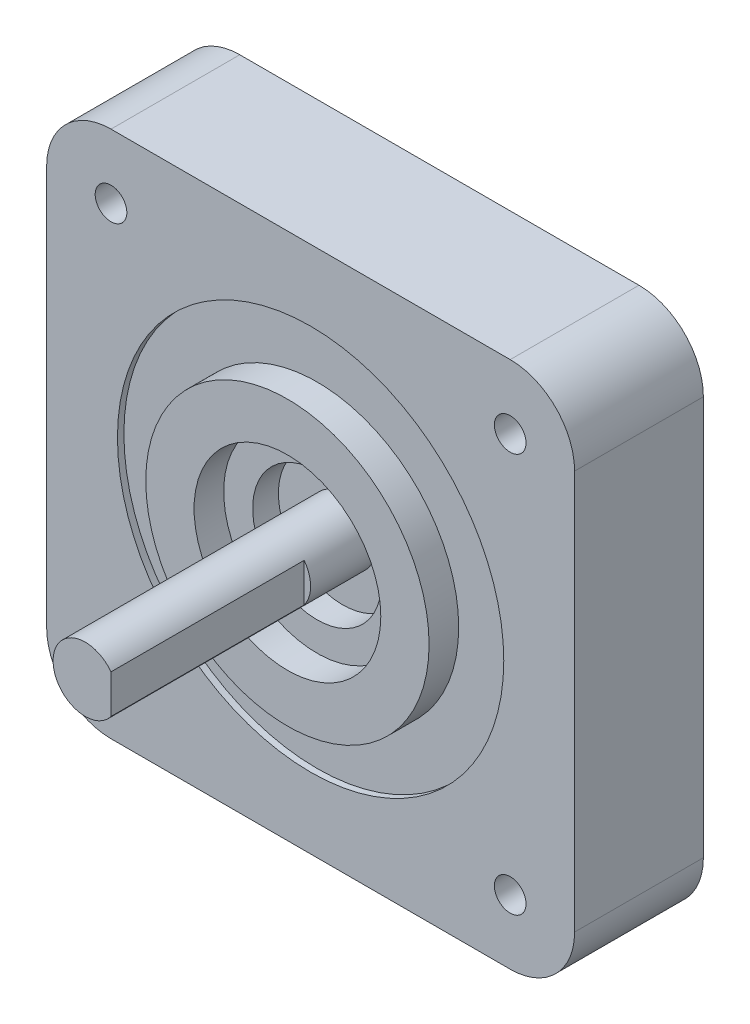
ISO-10303-21;
HEADER;
FILE_DESCRIPTION(('STEP AP214'),'2;1');
FILE_NAME('part.step','',(''),(''),'','','');
FILE_SCHEMA(('AUTOMOTIVE_DESIGN { 1 0 10303 214 1 1 1 1 }'));
ENDSEC;
DATA;
#1=APPLICATION_CONTEXT('core data for automotive mechanical design processes');
#2=APPLICATION_PROTOCOL_DEFINITION('international standard','automotive_design',2000,#1);
#3=PRODUCT_CONTEXT('',#1,'mechanical');
#4=PRODUCT('Part','Part','',(#3));
#5=PRODUCT_RELATED_PRODUCT_CATEGORY('part','',(#4));
#6=PRODUCT_DEFINITION_FORMATION('','',#4);
#7=PRODUCT_DEFINITION_CONTEXT('part definition',#1,'design');
#8=PRODUCT_DEFINITION('design','',#6,#7);
#9=PRODUCT_DEFINITION_SHAPE('','',#8);
#10=(LENGTH_UNIT() NAMED_UNIT(*) SI_UNIT(.MILLI.,.METRE.));
#11=(NAMED_UNIT(*) PLANE_ANGLE_UNIT() SI_UNIT($,.RADIAN.));
#12=(NAMED_UNIT(*) SI_UNIT($,.STERADIAN.) SOLID_ANGLE_UNIT());
#13=UNCERTAINTY_MEASURE_WITH_UNIT(LENGTH_MEASURE(1.E-05),#10,'distance_accuracy_value','');
#14=(GEOMETRIC_REPRESENTATION_CONTEXT(3) GLOBAL_UNCERTAINTY_ASSIGNED_CONTEXT((#13)) GLOBAL_UNIT_ASSIGNED_CONTEXT((#10,
#11,#12)) REPRESENTATION_CONTEXT('',''));
#15=CARTESIAN_POINT('',(0.,0.,0.));
#16=DIRECTION('',(0.,0.,1.));
#17=DIRECTION('',(1.,0.,0.));
#18=AXIS2_PLACEMENT_3D('',#15,#16,#17);
#19=CARTESIAN_POINT('',(-17.0093412516215,7.4714848281993,27.5));
#20=DIRECTION('',(0.,0.,-1.));
#21=DIRECTION('',(0.,-1.,0.));
#22=AXIS2_PLACEMENT_3D('',#19,#20,#21);
#23=PLANE('',#22);
#24=CARTESIAN_POINT('',(-17.0093412516215,7.4714848281993,27.5));
#25=DIRECTION('',(0.,0.,-1.));
#26=DIRECTION('',(1.,0.,0.));
#27=AXIS2_PLACEMENT_3D('',#24,#25,#26);
#28=CIRCLE('',#27,2.5);
#29=CARTESIAN_POINT('',(-15.0093412516216,5.9714848281993,27.5));
#30=VERTEX_POINT('',#29);
#31=CARTESIAN_POINT('',(-15.0093412516216,8.9714848281993,27.5));
#32=VERTEX_POINT('',#31);
#33=EDGE_CURVE('E38',#30,#32,#28,.T.);
#34=ORIENTED_EDGE('',*,*,#33,.F.);
#35=DIRECTION('',(0.,1.,0.));
#36=VECTOR('',#35,1.);
#37=CARTESIAN_POINT('',(-15.0093412516216,8.9714848281993,27.5));
#38=LINE('',#37,#36);
#39=EDGE_CURVE('E10',#30,#32,#38,.T.);
#40=ORIENTED_EDGE('',*,*,#39,.T.);
#41=EDGE_LOOP('',(#34,#40));
#42=FACE_BOUND('',#41,.T.);
#43=ADVANCED_FACE('F17',(#42),#23,.F.);
#44=CARTESIAN_POINT('',(-15.0093412516216,8.9714848281993,27.5));
#45=DIRECTION('',(-1.,0.,0.));
#46=DIRECTION('',(0.,0.,1.));
#47=AXIS2_PLACEMENT_3D('',#44,#45,#46);
#48=PLANE('',#47);
#49=DIRECTION('',(0.,0.,-1.));
#50=VECTOR('',#49,1.);
#51=CARTESIAN_POINT('',(-15.0093412516216,8.9714848281993,7.5));
#52=LINE('',#51,#50);
#53=CARTESIAN_POINT('',(-15.0093412516216,8.9714848281993,12.5));
#54=VERTEX_POINT('',#53);
#55=EDGE_CURVE('E183',#32,#54,#52,.T.);
#56=ORIENTED_EDGE('',*,*,#55,.F.);
#57=ORIENTED_EDGE('',*,*,#39,.F.);
#58=DIRECTION('',(0.,0.,1.));
#59=VECTOR('',#58,1.);
#60=CARTESIAN_POINT('',(-15.0093412516216,5.9714848281993,7.5));
#61=LINE('',#60,#59);
#62=CARTESIAN_POINT('',(-15.0093412516216,5.9714848281993,12.5));
#63=VERTEX_POINT('',#62);
#64=EDGE_CURVE('E229',#63,#30,#61,.T.);
#65=ORIENTED_EDGE('',*,*,#64,.F.);
#66=DIRECTION('',(0.,-1.,0.));
#67=VECTOR('',#66,1.);
#68=CARTESIAN_POINT('',(-15.0093412516216,7.4714848281993,12.5));
#69=LINE('',#68,#67);
#70=EDGE_CURVE('E26',#54,#63,#69,.T.);
#71=ORIENTED_EDGE('',*,*,#70,.F.);
#72=EDGE_LOOP('',(#56,#57,#65,#71));
#73=FACE_BOUND('',#72,.T.);
#74=ADVANCED_FACE('F242',(#73),#48,.F.);
#75=CARTESIAN_POINT('',(-14.8551382658065,7.4714848281993,12.5));
#76=DIRECTION('',(0.,0.,1.));
#77=DIRECTION('',(1.,0.,0.));
#78=AXIS2_PLACEMENT_3D('',#75,#76,#77);
#79=PLANE('',#78);
#80=ORIENTED_EDGE('',*,*,#70,.T.);
#81=CARTESIAN_POINT('',(-17.0093412516215,7.4714848281993,12.5));
#82=DIRECTION('',(0.,0.,-1.));
#83=DIRECTION('',(1.,0.,0.));
#84=AXIS2_PLACEMENT_3D('',#81,#82,#83);
#85=CIRCLE('',#84,2.5);
#86=EDGE_CURVE('E155',#54,#63,#85,.T.);
#87=ORIENTED_EDGE('',*,*,#86,.F.);
#88=EDGE_LOOP('',(#80,#87));
#89=FACE_BOUND('',#88,.T.);
#90=ADVANCED_FACE('F248',(#89),#79,.T.);
#91=CARTESIAN_POINT('',(-17.0093412516215,7.4714848281993,7.5));
#92=DIRECTION('',(0.,0.,1.));
#93=DIRECTION('',(1.,0.,0.));
#94=AXIS2_PLACEMENT_3D('',#91,#92,#93);
#95=PLANE('',#94);
#96=CARTESIAN_POINT('',(-17.0093412516215,7.4714848281993,7.5));
#97=DIRECTION('',(0.,0.,-1.));
#98=DIRECTION('',(1.,0.,0.));
#99=AXIS2_PLACEMENT_3D('',#96,#97,#98);
#100=CIRCLE('',#99,2.5);
#101=CARTESIAN_POINT('',(-14.5093412516215,7.4714848281993,7.5));
#102=VERTEX_POINT('',#101);
#103=EDGE_CURVE('E177',#102,#102,#100,.T.);
#104=ORIENTED_EDGE('',*,*,#103,.T.);
#105=EDGE_LOOP('',(#104));
#106=FACE_BOUND('',#105,.T.);
#107=CARTESIAN_POINT('',(-17.0093412516215,7.4714848281993,7.5));
#108=DIRECTION('',(0.,0.,1.));
#109=DIRECTION('',(1.,0.,0.));
#110=AXIS2_PLACEMENT_3D('',#107,#108,#109);
#111=CIRCLE('',#110,5.);
#112=CARTESIAN_POINT('',(-12.0093412516215,7.4714848281993,7.5));
#113=VERTEX_POINT('',#112);
#114=EDGE_CURVE('E160',#113,#113,#111,.T.);
#115=ORIENTED_EDGE('',*,*,#114,.T.);
#116=EDGE_LOOP('',(#115));
#117=FACE_BOUND('',#116,.T.);
#118=ADVANCED_FACE('F254',(#106,#117),#95,.T.);
#119=CARTESIAN_POINT('',(-17.0093412516215,7.4714848281993,9.5));
#120=DIRECTION('',(0.,0.,1.));
#121=DIRECTION('',(1.,0.,0.));
#122=AXIS2_PLACEMENT_3D('',#119,#120,#121);
#123=PLANE('',#122);
#124=CARTESIAN_POINT('',(-17.0093412516215,7.4714848281993,9.5));
#125=DIRECTION('',(0.,0.,-1.));
#126=DIRECTION('',(1.,0.,0.));
#127=AXIS2_PLACEMENT_3D('',#124,#125,#126);
#128=CIRCLE('',#127,5.);
#129=CARTESIAN_POINT('',(-12.0093412516215,7.4714848281993,9.5));
#130=VERTEX_POINT('',#129);
#131=EDGE_CURVE('E173',#130,#130,#128,.T.);
#132=ORIENTED_EDGE('',*,*,#131,.T.);
#133=EDGE_LOOP('',(#132));
#134=FACE_BOUND('',#133,.T.);
#135=CARTESIAN_POINT('',(-17.0093412516215,7.4714848281993,9.5));
#136=DIRECTION('',(0.,0.,1.));
#137=DIRECTION('',(1.,0.,0.));
#138=AXIS2_PLACEMENT_3D('',#135,#136,#137);
#139=CIRCLE('',#138,7.25);
#140=CARTESIAN_POINT('',(-9.75934125162155,7.4714848281993,9.5));
#141=VERTEX_POINT('',#140);
#142=EDGE_CURVE('E149',#141,#141,#139,.T.);
#143=ORIENTED_EDGE('',*,*,#142,.T.);
#144=EDGE_LOOP('',(#143));
#145=FACE_BOUND('',#144,.T.);
#146=ADVANCED_FACE('F328',(#134,#145),#123,.T.);
#147=CARTESIAN_POINT('',(-17.0093412516215,7.4714848281993,11.8));
#148=DIRECTION('',(0.,0.,-1.));
#149=DIRECTION('',(0.,-1.,0.));
#150=AXIS2_PLACEMENT_3D('',#147,#148,#149);
#151=PLANE('',#150);
#152=CARTESIAN_POINT('',(-17.0093412516215,7.4714848281993,11.8));
#153=DIRECTION('',(0.,0.,1.));
#154=DIRECTION('',(1.,0.,0.));
#155=AXIS2_PLACEMENT_3D('',#152,#153,#154);
#156=CIRCLE('',#155,7.25);
#157=CARTESIAN_POINT('',(-9.75934125162155,7.4714848281993,11.8));
#158=VERTEX_POINT('',#157);
#159=EDGE_CURVE('E156',#158,#158,#156,.T.);
#160=ORIENTED_EDGE('',*,*,#159,.F.);
#161=EDGE_LOOP('',(#160));
#162=FACE_BOUND('',#161,.T.);
#163=CARTESIAN_POINT('',(-17.0093412516215,7.4714848281993,11.8));
#164=DIRECTION('',(0.,0.,-1.));
#165=DIRECTION('',(1.,0.,0.));
#166=AXIS2_PLACEMENT_3D('',#163,#164,#165);
#167=CIRCLE('',#166,11.);
#168=CARTESIAN_POINT('',(-6.00934125162155,7.4714848281993,11.8));
#169=VERTEX_POINT('',#168);
#170=EDGE_CURVE('E397',#169,#169,#167,.T.);
#171=ORIENTED_EDGE('',*,*,#170,.F.);
#172=EDGE_LOOP('',(#171));
#173=FACE_BOUND('',#172,.T.);
#174=ADVANCED_FACE('F324',(#162,#173),#151,.F.);
#175=CARTESIAN_POINT('',(-17.0093412516215,7.4714848281993,9.5));
#176=DIRECTION('',(0.,0.,-1.));
#177=DIRECTION('',(0.,-1.,0.));
#178=AXIS2_PLACEMENT_3D('',#175,#176,#177);
#179=PLANE('',#178);
#180=CARTESIAN_POINT('',(-17.0093412516215,7.4714848281993,9.5));
#181=DIRECTION('',(0.,0.,1.));
#182=DIRECTION('',(1.,0.,0.));
#183=AXIS2_PLACEMENT_3D('',#180,#181,#182);
#184=CIRCLE('',#183,11.);
#185=CARTESIAN_POINT('',(-6.00934125162155,7.4714848281993,9.5));
#186=VERTEX_POINT('',#185);
#187=EDGE_CURVE('E401',#186,#186,#184,.T.);
#188=ORIENTED_EDGE('',*,*,#187,.F.);
#189=EDGE_LOOP('',(#188));
#190=FACE_BOUND('',#189,.T.);
#191=CARTESIAN_POINT('',(-17.0093412516215,7.4714848281993,9.5));
#192=DIRECTION('',(0.,0.,1.));
#193=DIRECTION('',(-1.,0.,0.));
#194=AXIS2_PLACEMENT_3D('',#191,#192,#193);
#195=CIRCLE('',#194,15.);
#196=CARTESIAN_POINT('',(-32.0093412516216,7.4714848281993,9.5));
#197=VERTEX_POINT('',#196);
#198=EDGE_CURVE('E416',#197,#197,#195,.T.);
#199=ORIENTED_EDGE('',*,*,#198,.T.);
#200=EDGE_LOOP('',(#199));
#201=FACE_BOUND('',#200,.T.);
#202=ADVANCED_FACE('F321',(#190,#201),#179,.F.);
#203=CARTESIAN_POINT('',(-1.50934125162156,22.9714848281993,6.));
#204=DIRECTION('',(0.,0.,1.));
#205=DIRECTION('',(1.,0.,0.));
#206=AXIS2_PLACEMENT_3D('',#203,#204,#205);
#207=PLANE('',#206);
#208=CARTESIAN_POINT('',(-1.50934125162156,22.9714848281993,6.));
#209=DIRECTION('',(0.,0.,1.));
#210=DIRECTION('',(1.,0.,0.));
#211=AXIS2_PLACEMENT_3D('',#208,#209,#210);
#212=CIRCLE('',#211,1.2295);
#213=CARTESIAN_POINT('',(-0.27984125162156,22.9714848281993,6.));
#214=VERTEX_POINT('',#213);
#215=EDGE_CURVE('E394',#214,#214,#212,.T.);
#216=ORIENTED_EDGE('',*,*,#215,.T.);
#217=EDGE_LOOP('',(#216));
#218=FACE_BOUND('',#217,.T.);
#219=ADVANCED_FACE('F317',(#218),#207,.T.);
#220=CARTESIAN_POINT('',(-32.5093412516215,22.9714848281993,6.));
#221=DIRECTION('',(0.,0.,1.));
#222=DIRECTION('',(1.,0.,0.));
#223=AXIS2_PLACEMENT_3D('',#220,#221,#222);
#224=PLANE('',#223);
#225=CARTESIAN_POINT('',(-32.5093412516215,22.9714848281993,6.));
#226=DIRECTION('',(0.,0.,1.));
#227=DIRECTION('',(1.,0.,0.));
#228=AXIS2_PLACEMENT_3D('',#225,#226,#227);
#229=CIRCLE('',#228,1.2295);
#230=CARTESIAN_POINT('',(-31.2798412516215,22.9714848281993,6.));
#231=VERTEX_POINT('',#230);
#232=EDGE_CURVE('E380',#231,#231,#229,.T.);
#233=ORIENTED_EDGE('',*,*,#232,.T.);
#234=EDGE_LOOP('',(#233));
#235=FACE_BOUND('',#234,.T.);
#236=ADVANCED_FACE('F301',(#235),#224,.T.);
#237=CARTESIAN_POINT('',(-32.5093412516215,-8.02851517180071,6.));
#238=DIRECTION('',(0.,0.,1.));
#239=DIRECTION('',(1.,0.,0.));
#240=AXIS2_PLACEMENT_3D('',#237,#238,#239);
#241=PLANE('',#240);
#242=CARTESIAN_POINT('',(-32.5093412516215,-8.02851517180071,6.));
#243=DIRECTION('',(0.,0.,1.));
#244=DIRECTION('',(1.,0.,0.));
#245=AXIS2_PLACEMENT_3D('',#242,#243,#244);
#246=CIRCLE('',#245,1.2295);
#247=CARTESIAN_POINT('',(-31.2798412516215,-8.02851517180071,6.));
#248=VERTEX_POINT('',#247);
#249=EDGE_CURVE('E372',#248,#248,#246,.T.);
#250=ORIENTED_EDGE('',*,*,#249,.T.);
#251=EDGE_LOOP('',(#250));
#252=FACE_BOUND('',#251,.T.);
#253=ADVANCED_FACE('F297',(#252),#241,.T.);
#254=CARTESIAN_POINT('',(-1.50934125162156,-8.02851517180071,6.));
#255=DIRECTION('',(0.,0.,1.));
#256=DIRECTION('',(1.,0.,0.));
#257=AXIS2_PLACEMENT_3D('',#254,#255,#256);
#258=PLANE('',#257);
#259=CARTESIAN_POINT('',(-1.50934125162156,-8.02851517180071,6.));
#260=DIRECTION('',(0.,0.,1.));
#261=DIRECTION('',(1.,0.,0.));
#262=AXIS2_PLACEMENT_3D('',#259,#260,#261);
#263=CIRCLE('',#262,1.2295);
#264=CARTESIAN_POINT('',(-0.27984125162156,-8.02851517180071,6.));
#265=VERTEX_POINT('',#264);
#266=EDGE_CURVE('E383',#265,#265,#263,.T.);
#267=ORIENTED_EDGE('',*,*,#266,.T.);
#268=EDGE_LOOP('',(#267));
#269=FACE_BOUND('',#268,.T.);
#270=ADVANCED_FACE('F300',(#269),#258,.T.);
#271=CARTESIAN_POINT('',(-17.0093412516215,7.47148482819929,10.));
#272=DIRECTION('',(0.,0.,1.));
#273=DIRECTION('',(1.,0.,0.));
#274=AXIS2_PLACEMENT_3D('',#271,#272,#273);
#275=PLANE('',#274);
#276=CARTESIAN_POINT('',(-17.0093412516215,7.4714848281993,10.));
#277=DIRECTION('',(0.,0.,-1.));
#278=DIRECTION('',(-1.,0.,0.));
#279=AXIS2_PLACEMENT_3D('',#276,#277,#278);
#280=CIRCLE('',#279,15.);
#281=CARTESIAN_POINT('',(-32.0093412516216,7.4714848281993,10.));
#282=VERTEX_POINT('',#281);
#283=EDGE_CURVE('E412',#282,#282,#280,.T.);
#284=ORIENTED_EDGE('',*,*,#283,.T.);
#285=EDGE_LOOP('',(#284));
#286=FACE_BOUND('',#285,.T.);
#287=CARTESIAN_POINT('',(-1.50934125162156,22.9714848281993,10.));
#288=DIRECTION('',(0.,0.,-1.));
#289=DIRECTION('',(1.,0.,0.));
#290=AXIS2_PLACEMENT_3D('',#287,#288,#289);
#291=CIRCLE('',#290,1.2295);
#292=CARTESIAN_POINT('',(-0.27984125162156,22.9714848281993,10.));
#293=VERTEX_POINT('',#292);
#294=EDGE_CURVE('E408',#293,#293,#291,.T.);
#295=ORIENTED_EDGE('',*,*,#294,.T.);
#296=EDGE_LOOP('',(#295));
#297=FACE_BOUND('',#296,.T.);
#298=CARTESIAN_POINT('',(-32.5093412516215,22.9714848281993,10.));
#299=DIRECTION('',(0.,0.,-1.));
#300=DIRECTION('',(1.,0.,0.));
#301=AXIS2_PLACEMENT_3D('',#298,#299,#300);
#302=CIRCLE('',#301,1.2295);
#303=CARTESIAN_POINT('',(-31.2798412516215,22.9714848281993,10.));
#304=VERTEX_POINT('',#303);
#305=EDGE_CURVE('E390',#304,#304,#302,.T.);
#306=ORIENTED_EDGE('',*,*,#305,.T.);
#307=EDGE_LOOP('',(#306));
#308=FACE_BOUND('',#307,.T.);
#309=CARTESIAN_POINT('',(-32.5093412516215,-8.02851517180071,10.));
#310=DIRECTION('',(0.,0.,-1.));
#311=DIRECTION('',(1.,0.,0.));
#312=AXIS2_PLACEMENT_3D('',#309,#310,#311);
#313=CIRCLE('',#312,1.2295);
#314=CARTESIAN_POINT('',(-31.2798412516215,-8.02851517180071,10.));
#315=VERTEX_POINT('',#314);
#316=EDGE_CURVE('E369',#315,#315,#313,.T.);
#317=ORIENTED_EDGE('',*,*,#316,.T.);
#318=EDGE_LOOP('',(#317));
#319=FACE_BOUND('',#318,.T.);
#320=CARTESIAN_POINT('',(-1.50934125162156,-8.02851517180071,10.));
#321=DIRECTION('',(0.,0.,-1.));
#322=DIRECTION('',(1.,0.,0.));
#323=AXIS2_PLACEMENT_3D('',#320,#321,#322);
#324=CIRCLE('',#323,1.2295);
#325=CARTESIAN_POINT('',(-0.27984125162156,-8.02851517180071,10.));
#326=VERTEX_POINT('',#325);
#327=EDGE_CURVE('E374',#326,#326,#324,.T.);
#328=ORIENTED_EDGE('',*,*,#327,.T.);
#329=EDGE_LOOP('',(#328));
#330=FACE_BOUND('',#329,.T.);
#331=CARTESIAN_POINT('',(-32.5093412516215,22.9714848281993,10.));
#332=DIRECTION('',(0.,0.,-1.));
#333=DIRECTION('',(1.,0.,0.));
#334=AXIS2_PLACEMENT_3D('',#331,#332,#333);
#335=CIRCLE('',#334,5.);
#336=CARTESIAN_POINT('',(-37.5093412516215,22.9714848281993,10.));
#337=VERTEX_POINT('',#336);
#338=CARTESIAN_POINT('',(-32.5093412516215,27.9714848281993,10.));
#339=VERTEX_POINT('',#338);
#340=EDGE_CURVE('E117',#337,#339,#335,.T.);
#341=ORIENTED_EDGE('',*,*,#340,.F.);
#342=DIRECTION('',(0.,1.,0.));
#343=VECTOR('',#342,1.);
#344=CARTESIAN_POINT('',(-37.5093412516215,-13.0285151718007,10.));
#345=LINE('',#344,#343);
#346=CARTESIAN_POINT('',(-37.5093412516215,-8.02851517180071,10.));
#347=VERTEX_POINT('',#346);
#348=EDGE_CURVE('E140',#347,#337,#345,.T.);
#349=ORIENTED_EDGE('',*,*,#348,.F.);
#350=CARTESIAN_POINT('',(-32.5093412516215,-8.02851517180071,10.));
#351=DIRECTION('',(0.,0.,-1.));
#352=DIRECTION('',(1.,0.,0.));
#353=AXIS2_PLACEMENT_3D('',#350,#351,#352);
#354=CIRCLE('',#353,5.);
#355=CARTESIAN_POINT('',(-32.5093412516215,-13.0285151718007,10.));
#356=VERTEX_POINT('',#355);
#357=EDGE_CURVE('E207',#356,#347,#354,.T.);
#358=ORIENTED_EDGE('',*,*,#357,.F.);
#359=DIRECTION('',(-1.,0.,0.));
#360=VECTOR('',#359,1.);
#361=CARTESIAN_POINT('',(3.49065874837844,-13.0285151718007,10.));
#362=LINE('',#361,#360);
#363=CARTESIAN_POINT('',(-1.50934125162156,-13.0285151718007,10.));
#364=VERTEX_POINT('',#363);
#365=EDGE_CURVE('E220',#364,#356,#362,.T.);
#366=ORIENTED_EDGE('',*,*,#365,.F.);
#367=CARTESIAN_POINT('',(-1.50934125162156,-8.02851517180071,10.));
#368=DIRECTION('',(0.,0.,-1.));
#369=DIRECTION('',(1.,0.,0.));
#370=AXIS2_PLACEMENT_3D('',#367,#368,#369);
#371=CIRCLE('',#370,5.);
#372=CARTESIAN_POINT('',(3.49065874837844,-8.02851517180071,10.));
#373=VERTEX_POINT('',#372);
#374=EDGE_CURVE('E164',#373,#364,#371,.T.);
#375=ORIENTED_EDGE('',*,*,#374,.F.);
#376=DIRECTION('',(0.,-1.,0.));
#377=VECTOR('',#376,1.);
#378=CARTESIAN_POINT('',(3.49065874837844,27.9714848281993,10.));
#379=LINE('',#378,#377);
#380=CARTESIAN_POINT('',(3.49065874837844,22.9714848281993,10.));
#381=VERTEX_POINT('',#380);
#382=EDGE_CURVE('E165',#381,#373,#379,.T.);
#383=ORIENTED_EDGE('',*,*,#382,.F.);
#384=CARTESIAN_POINT('',(-1.50934125162156,22.9714848281993,10.));
#385=DIRECTION('',(0.,0.,-1.));
#386=DIRECTION('',(1.,0.,0.));
#387=AXIS2_PLACEMENT_3D('',#384,#385,#386);
#388=CIRCLE('',#387,5.);
#389=CARTESIAN_POINT('',(-1.50934125162156,27.9714848281993,10.));
#390=VERTEX_POINT('',#389);
#391=EDGE_CURVE('E120',#390,#381,#388,.T.);
#392=ORIENTED_EDGE('',*,*,#391,.F.);
#393=DIRECTION('',(1.,0.,0.));
#394=VECTOR('',#393,1.);
#395=CARTESIAN_POINT('',(-37.5093412516215,27.9714848281993,10.));
#396=LINE('',#395,#394);
#397=EDGE_CURVE('E113',#339,#390,#396,.T.);
#398=ORIENTED_EDGE('',*,*,#397,.F.);
#399=EDGE_LOOP('',(#341,#349,#358,#366,#375,#383,#392,#398));
#400=FACE_BOUND('',#399,.T.);
#401=ADVANCED_FACE('F115',(#286,#297,#308,#319,#330,#400),#275,.T.);
#402=CARTESIAN_POINT('',(3.49065874837844,-13.0285151718007,0.));
#403=DIRECTION('',(0.,-1.,0.));
#404=DIRECTION('',(0.,0.,-1.));
#405=AXIS2_PLACEMENT_3D('',#402,#403,#404);
#406=PLANE('',#405);
#407=DIRECTION('',(0.,0.,-1.));
#408=VECTOR('',#407,1.);
#409=CARTESIAN_POINT('',(-1.50934125162156,-13.0285151718007,0.));
#410=LINE('',#409,#408);
#411=CARTESIAN_POINT('',(-1.50934125162156,-13.0285151718007,0.));
#412=VERTEX_POINT('',#411);
#413=EDGE_CURVE('E217',#364,#412,#410,.T.);
#414=ORIENTED_EDGE('',*,*,#413,.F.);
#415=ORIENTED_EDGE('',*,*,#365,.T.);
#416=DIRECTION('',(0.,0.,1.));
#417=VECTOR('',#416,1.);
#418=CARTESIAN_POINT('',(-32.5093412516215,-13.0285151718007,0.));
#419=LINE('',#418,#417);
#420=CARTESIAN_POINT('',(-32.5093412516215,-13.0285151718007,0.));
#421=VERTEX_POINT('',#420);
#422=EDGE_CURVE('E212',#421,#356,#419,.T.);
#423=ORIENTED_EDGE('',*,*,#422,.F.);
#424=DIRECTION('',(1.,0.,0.));
#425=VECTOR('',#424,1.);
#426=CARTESIAN_POINT('',(-17.0093412516215,-13.0285151718007,0.));
#427=LINE('',#426,#425);
#428=EDGE_CURVE('E202',#421,#412,#427,.T.);
#429=ORIENTED_EDGE('',*,*,#428,.T.);
#430=EDGE_LOOP('',(#414,#415,#423,#429));
#431=FACE_BOUND('',#430,.T.);
#432=ADVANCED_FACE('F307',(#431),#406,.T.);
#433=CARTESIAN_POINT('',(-1.50934125162156,-8.02851517180071,0.));
#434=DIRECTION('',(0.,0.,1.));
#435=DIRECTION('',(1.,0.,0.));
#436=AXIS2_PLACEMENT_3D('',#433,#434,#435);
#437=CYLINDRICAL_SURFACE('',#436,5.);
#438=CARTESIAN_POINT('',(-1.50934125162156,-8.02851517180071,0.));
#439=DIRECTION('',(0.,0.,1.));
#440=DIRECTION('',(1.,0.,0.));
#441=AXIS2_PLACEMENT_3D('',#438,#439,#440);
#442=CIRCLE('',#441,5.);
#443=CARTESIAN_POINT('',(3.49065874837844,-8.02851517180071,0.));
#444=VERTEX_POINT('',#443);
#445=EDGE_CURVE('E198',#412,#444,#442,.T.);
#446=ORIENTED_EDGE('',*,*,#445,.T.);
#447=DIRECTION('',(0.,0.,-1.));
#448=VECTOR('',#447,1.);
#449=CARTESIAN_POINT('',(3.49065874837844,-8.02851517180071,0.));
#450=LINE('',#449,#448);
#451=EDGE_CURVE('E161',#373,#444,#450,.T.);
#452=ORIENTED_EDGE('',*,*,#451,.F.);
#453=ORIENTED_EDGE('',*,*,#374,.T.);
#454=ORIENTED_EDGE('',*,*,#413,.T.);
#455=EDGE_LOOP('',(#446,#452,#453,#454));
#456=FACE_BOUND('',#455,.T.);
#457=ADVANCED_FACE('F290',(#456),#437,.T.);
#458=CARTESIAN_POINT('',(3.49065874837844,27.9714848281993,0.));
#459=DIRECTION('',(1.,0.,0.));
#460=DIRECTION('',(0.,1.,0.));
#461=AXIS2_PLACEMENT_3D('',#458,#459,#460);
#462=PLANE('',#461);
#463=DIRECTION('',(0.,0.,-1.));
#464=VECTOR('',#463,1.);
#465=CARTESIAN_POINT('',(3.49065874837844,22.9714848281993,0.));
#466=LINE('',#465,#464);
#467=CARTESIAN_POINT('',(3.49065874837844,22.9714848281993,0.));
#468=VERTEX_POINT('',#467);
#469=EDGE_CURVE('E169',#381,#468,#466,.T.);
#470=ORIENTED_EDGE('',*,*,#469,.F.);
#471=ORIENTED_EDGE('',*,*,#382,.T.);
#472=ORIENTED_EDGE('',*,*,#451,.T.);
#473=DIRECTION('',(0.,1.,0.));
#474=VECTOR('',#473,1.);
#475=CARTESIAN_POINT('',(3.49065874837844,7.47148482819929,0.));
#476=LINE('',#475,#474);
#477=EDGE_CURVE('E194',#444,#468,#476,.T.);
#478=ORIENTED_EDGE('',*,*,#477,.T.);
#479=EDGE_LOOP('',(#470,#471,#472,#478));
#480=FACE_BOUND('',#479,.T.);
#481=ADVANCED_FACE('F286',(#480),#462,.T.);
#482=CARTESIAN_POINT('',(-1.50934125162156,22.9714848281993,0.));
#483=DIRECTION('',(0.,0.,1.));
#484=DIRECTION('',(1.,0.,0.));
#485=AXIS2_PLACEMENT_3D('',#482,#483,#484);
#486=CYLINDRICAL_SURFACE('',#485,5.);
#487=CARTESIAN_POINT('',(-1.50934125162156,22.9714848281993,0.));
#488=DIRECTION('',(0.,0.,1.));
#489=DIRECTION('',(1.,0.,0.));
#490=AXIS2_PLACEMENT_3D('',#487,#488,#489);
#491=CIRCLE('',#490,5.);
#492=CARTESIAN_POINT('',(-1.50934125162156,27.9714848281993,0.));
#493=VERTEX_POINT('',#492);
#494=EDGE_CURVE('E193',#468,#493,#491,.T.);
#495=ORIENTED_EDGE('',*,*,#494,.T.);
#496=DIRECTION('',(0.,0.,-1.));
#497=VECTOR('',#496,1.);
#498=CARTESIAN_POINT('',(-1.50934125162156,27.9714848281993,0.));
#499=LINE('',#498,#497);
#500=EDGE_CURVE('E124',#390,#493,#499,.T.);
#501=ORIENTED_EDGE('',*,*,#500,.F.);
#502=ORIENTED_EDGE('',*,*,#391,.T.);
#503=ORIENTED_EDGE('',*,*,#469,.T.);
#504=EDGE_LOOP('',(#495,#501,#502,#503));
#505=FACE_BOUND('',#504,.T.);
#506=ADVANCED_FACE('F289',(#505),#486,.T.);
#507=CARTESIAN_POINT('',(-37.5093412516215,27.9714848281993,0.));
#508=DIRECTION('',(0.,1.,0.));
#509=DIRECTION('',(1.,0.,0.));
#510=AXIS2_PLACEMENT_3D('',#507,#508,#509);
#511=PLANE('',#510);
#512=DIRECTION('',(0.,0.,-1.));
#513=VECTOR('',#512,1.);
#514=CARTESIAN_POINT('',(-32.5093412516215,27.9714848281993,0.));
#515=LINE('',#514,#513);
#516=CARTESIAN_POINT('',(-32.5093412516215,27.9714848281993,0.));
#517=VERTEX_POINT('',#516);
#518=EDGE_CURVE('E125',#339,#517,#515,.T.);
#519=ORIENTED_EDGE('',*,*,#518,.F.);
#520=ORIENTED_EDGE('',*,*,#397,.T.);
#521=ORIENTED_EDGE('',*,*,#500,.T.);
#522=DIRECTION('',(-1.,0.,0.));
#523=VECTOR('',#522,1.);
#524=CARTESIAN_POINT('',(-17.0093412516215,27.9714848281993,0.));
#525=LINE('',#524,#523);
#526=EDGE_CURVE('E130',#493,#517,#525,.T.);
#527=ORIENTED_EDGE('',*,*,#526,.T.);
#528=EDGE_LOOP('',(#519,#520,#521,#527));
#529=FACE_BOUND('',#528,.T.);
#530=ADVANCED_FACE('F128',(#529),#511,.T.);
#531=CARTESIAN_POINT('',(-32.5093412516215,22.9714848281993,0.));
#532=DIRECTION('',(0.,0.,1.));
#533=DIRECTION('',(1.,0.,0.));
#534=AXIS2_PLACEMENT_3D('',#531,#532,#533);
#535=CYLINDRICAL_SURFACE('',#534,5.);
#536=CARTESIAN_POINT('',(-32.5093412516215,22.9714848281993,0.));
#537=DIRECTION('',(0.,0.,1.));
#538=DIRECTION('',(1.,0.,0.));
#539=AXIS2_PLACEMENT_3D('',#536,#537,#538);
#540=CIRCLE('',#539,5.);
#541=CARTESIAN_POINT('',(-37.5093412516215,22.9714848281993,0.));
#542=VERTEX_POINT('',#541);
#543=EDGE_CURVE('E154',#517,#542,#540,.T.);
#544=ORIENTED_EDGE('',*,*,#543,.T.);
#545=DIRECTION('',(0.,0.,-1.));
#546=VECTOR('',#545,1.);
#547=CARTESIAN_POINT('',(-37.5093412516215,22.9714848281993,0.));
#548=LINE('',#547,#546);
#549=EDGE_CURVE('E138',#337,#542,#548,.T.);
#550=ORIENTED_EDGE('',*,*,#549,.F.);
#551=ORIENTED_EDGE('',*,*,#340,.T.);
#552=ORIENTED_EDGE('',*,*,#518,.T.);
#553=EDGE_LOOP('',(#544,#550,#551,#552));
#554=FACE_BOUND('',#553,.T.);
#555=ADVANCED_FACE('F137',(#554),#535,.T.);
#556=CARTESIAN_POINT('',(-37.5093412516215,-13.0285151718007,0.));
#557=DIRECTION('',(-1.,0.,0.));
#558=DIRECTION('',(0.,0.,1.));
#559=AXIS2_PLACEMENT_3D('',#556,#557,#558);
#560=PLANE('',#559);
#561=ORIENTED_EDGE('',*,*,#549,.T.);
#562=DIRECTION('',(0.,-1.,0.));
#563=VECTOR('',#562,1.);
#564=CARTESIAN_POINT('',(-37.5093412516215,7.47148482819929,0.));
#565=LINE('',#564,#563);
#566=CARTESIAN_POINT('',(-37.5093412516215,-8.02851517180071,0.));
#567=VERTEX_POINT('',#566);
#568=EDGE_CURVE('E150',#542,#567,#565,.T.);
#569=ORIENTED_EDGE('',*,*,#568,.T.);
#570=DIRECTION('',(0.,0.,-1.));
#571=VECTOR('',#570,1.);
#572=CARTESIAN_POINT('',(-37.5093412516215,-8.02851517180071,0.));
#573=LINE('',#572,#571);
#574=EDGE_CURVE('E211',#347,#567,#573,.T.);
#575=ORIENTED_EDGE('',*,*,#574,.F.);
#576=ORIENTED_EDGE('',*,*,#348,.T.);
#577=EDGE_LOOP('',(#561,#569,#575,#576));
#578=FACE_BOUND('',#577,.T.);
#579=ADVANCED_FACE('F284',(#578),#560,.T.);
#580=CARTESIAN_POINT('',(-32.5093412516215,-8.02851517180071,0.));
#581=DIRECTION('',(0.,0.,1.));
#582=DIRECTION('',(1.,0.,0.));
#583=AXIS2_PLACEMENT_3D('',#580,#581,#582);
#584=CYLINDRICAL_SURFACE('',#583,5.);
#585=CARTESIAN_POINT('',(-32.5093412516215,-8.02851517180071,0.));
#586=DIRECTION('',(0.,0.,1.));
#587=DIRECTION('',(1.,0.,0.));
#588=AXIS2_PLACEMENT_3D('',#585,#586,#587);
#589=CIRCLE('',#588,5.);
#590=EDGE_CURVE('E206',#567,#421,#589,.T.);
#591=ORIENTED_EDGE('',*,*,#590,.T.);
#592=ORIENTED_EDGE('',*,*,#422,.T.);
#593=ORIENTED_EDGE('',*,*,#357,.T.);
#594=ORIENTED_EDGE('',*,*,#574,.T.);
#595=EDGE_LOOP('',(#591,#592,#593,#594));
#596=FACE_BOUND('',#595,.T.);
#597=ADVANCED_FACE('F280',(#596),#584,.T.);
#598=CARTESIAN_POINT('',(-17.0093412516215,7.47148482819929,0.));
#599=DIRECTION('',(0.,0.,1.));
#600=DIRECTION('',(1.,0.,0.));
#601=AXIS2_PLACEMENT_3D('',#598,#599,#600);
#602=PLANE('',#601);
#603=ORIENTED_EDGE('',*,*,#568,.F.);
#604=ORIENTED_EDGE('',*,*,#543,.F.);
#605=ORIENTED_EDGE('',*,*,#526,.F.);
#606=ORIENTED_EDGE('',*,*,#494,.F.);
#607=ORIENTED_EDGE('',*,*,#477,.F.);
#608=ORIENTED_EDGE('',*,*,#445,.F.);
#609=ORIENTED_EDGE('',*,*,#428,.F.);
#610=ORIENTED_EDGE('',*,*,#590,.F.);
#611=EDGE_LOOP('',(#603,#604,#605,#606,#607,#608,#609,#610));
#612=FACE_BOUND('',#611,.T.);
#613=ADVANCED_FACE('F277',(#612),#602,.F.);
#614=CARTESIAN_POINT('',(-17.0093412516215,7.4714848281993,7.5));
#615=DIRECTION('',(0.,0.,1.));
#616=DIRECTION('',(1.,0.,0.));
#617=AXIS2_PLACEMENT_3D('',#614,#615,#616);
#618=CYLINDRICAL_SURFACE('',#617,2.5);
#619=ORIENTED_EDGE('',*,*,#64,.T.);
#620=ORIENTED_EDGE('',*,*,#33,.T.);
#621=ORIENTED_EDGE('',*,*,#55,.T.);
#622=ORIENTED_EDGE('',*,*,#86,.T.);
#623=EDGE_LOOP('',(#619,#620,#621,#622));
#624=FACE_BOUND('',#623,.T.);
#625=ORIENTED_EDGE('',*,*,#103,.F.);
#626=EDGE_LOOP('',(#625));
#627=FACE_BOUND('',#626,.T.);
#628=ADVANCED_FACE('F237',(#624,#627),#618,.T.);
#629=CARTESIAN_POINT('',(-17.0093412516215,7.4714848281993,8.75));
#630=DIRECTION('',(0.,0.,1.));
#631=DIRECTION('',(1.,0.,0.));
#632=AXIS2_PLACEMENT_3D('',#629,#630,#631);
#633=CYLINDRICAL_SURFACE('',#632,5.);
#634=ORIENTED_EDGE('',*,*,#131,.F.);
#635=EDGE_LOOP('',(#634));
#636=FACE_BOUND('',#635,.T.);
#637=ORIENTED_EDGE('',*,*,#114,.F.);
#638=EDGE_LOOP('',(#637));
#639=FACE_BOUND('',#638,.T.);
#640=ADVANCED_FACE('F273',(#636,#639),#633,.F.);
#641=CARTESIAN_POINT('',(-17.0093412516215,7.4714848281993,10.65));
#642=DIRECTION('',(0.,0.,1.));
#643=DIRECTION('',(1.,0.,0.));
#644=AXIS2_PLACEMENT_3D('',#641,#642,#643);
#645=CYLINDRICAL_SURFACE('',#644,7.25);
#646=ORIENTED_EDGE('',*,*,#159,.T.);
#647=EDGE_LOOP('',(#646));
#648=FACE_BOUND('',#647,.T.);
#649=ORIENTED_EDGE('',*,*,#142,.F.);
#650=EDGE_LOOP('',(#649));
#651=FACE_BOUND('',#650,.T.);
#652=ADVANCED_FACE('F268',(#648,#651),#645,.F.);
#653=CARTESIAN_POINT('',(-17.0093412516215,7.4714848281993,9.5));
#654=DIRECTION('',(0.,0.,1.));
#655=DIRECTION('',(1.,0.,0.));
#656=AXIS2_PLACEMENT_3D('',#653,#654,#655);
#657=CYLINDRICAL_SURFACE('',#656,11.);
#658=ORIENTED_EDGE('',*,*,#170,.T.);
#659=EDGE_LOOP('',(#658));
#660=FACE_BOUND('',#659,.T.);
#661=ORIENTED_EDGE('',*,*,#187,.T.);
#662=EDGE_LOOP('',(#661));
#663=FACE_BOUND('',#662,.T.);
#664=ADVANCED_FACE('F266',(#660,#663),#657,.T.);
#665=CARTESIAN_POINT('',(-17.0093412516215,7.4714848281993,10.));
#666=DIRECTION('',(0.,0.,-1.));
#667=DIRECTION('',(-1.,0.,0.));
#668=AXIS2_PLACEMENT_3D('',#665,#666,#667);
#669=CYLINDRICAL_SURFACE('',#668,15.);
#670=ORIENTED_EDGE('',*,*,#198,.F.);
#671=EDGE_LOOP('',(#670));
#672=FACE_BOUND('',#671,.T.);
#673=ORIENTED_EDGE('',*,*,#283,.F.);
#674=EDGE_LOOP('',(#673));
#675=FACE_BOUND('',#674,.T.);
#676=ADVANCED_FACE('F264',(#672,#675),#669,.F.);
#677=CARTESIAN_POINT('',(-1.50934125162156,22.9714848281993,8.));
#678=DIRECTION('',(0.,0.,1.));
#679=DIRECTION('',(1.,0.,0.));
#680=AXIS2_PLACEMENT_3D('',#677,#678,#679);
#681=CYLINDRICAL_SURFACE('',#680,1.2295);
#682=ORIENTED_EDGE('',*,*,#294,.F.);
#683=EDGE_LOOP('',(#682));
#684=FACE_BOUND('',#683,.T.);
#685=ORIENTED_EDGE('',*,*,#215,.F.);
#686=EDGE_LOOP('',(#685));
#687=FACE_BOUND('',#686,.T.);
#688=ADVANCED_FACE('F261',(#684,#687),#681,.F.);
#689=CARTESIAN_POINT('',(-32.5093412516215,22.9714848281993,8.));
#690=DIRECTION('',(0.,0.,1.));
#691=DIRECTION('',(1.,0.,0.));
#692=AXIS2_PLACEMENT_3D('',#689,#690,#691);
#693=CYLINDRICAL_SURFACE('',#692,1.2295);
#694=ORIENTED_EDGE('',*,*,#305,.F.);
#695=EDGE_LOOP('',(#694));
#696=FACE_BOUND('',#695,.T.);
#697=ORIENTED_EDGE('',*,*,#232,.F.);
#698=EDGE_LOOP('',(#697));
#699=FACE_BOUND('',#698,.T.);
#700=ADVANCED_FACE('F259',(#696,#699),#693,.F.);
#701=CARTESIAN_POINT('',(-32.5093412516215,-8.02851517180071,8.));
#702=DIRECTION('',(0.,0.,1.));
#703=DIRECTION('',(1.,0.,0.));
#704=AXIS2_PLACEMENT_3D('',#701,#702,#703);
#705=CYLINDRICAL_SURFACE('',#704,1.2295);
#706=ORIENTED_EDGE('',*,*,#316,.F.);
#707=EDGE_LOOP('',(#706));
#708=FACE_BOUND('',#707,.T.);
#709=ORIENTED_EDGE('',*,*,#249,.F.);
#710=EDGE_LOOP('',(#709));
#711=FACE_BOUND('',#710,.T.);
#712=ADVANCED_FACE('F353',(#708,#711),#705,.F.);
#713=CARTESIAN_POINT('',(-1.50934125162156,-8.02851517180071,8.));
#714=DIRECTION('',(0.,0.,1.));
#715=DIRECTION('',(1.,0.,0.));
#716=AXIS2_PLACEMENT_3D('',#713,#714,#715);
#717=CYLINDRICAL_SURFACE('',#716,1.2295);
#718=ORIENTED_EDGE('',*,*,#327,.F.);
#719=EDGE_LOOP('',(#718));
#720=FACE_BOUND('',#719,.T.);
#721=ORIENTED_EDGE('',*,*,#266,.F.);
#722=EDGE_LOOP('',(#721));
#723=FACE_BOUND('',#722,.T.);
#724=ADVANCED_FACE('F350',(#720,#723),#717,.F.);
#725=CLOSED_SHELL('',(#43,#74,#90,#118,#146,#174,#202,#219,#236,#253,#270,#401,#432,#457,#481,
#506,#530,#555,#579,#597,#613,#628,#640,#652,#664,#676,#688,#700,#712,#724));
#726=MANIFOLD_SOLID_BREP('B1',#725);
#727=ADVANCED_BREP_SHAPE_REPRESENTATION('',(#18,#726),#14);
#728=SHAPE_DEFINITION_REPRESENTATION(#9,#727);
ENDSEC;
END-ISO-10303-21;
